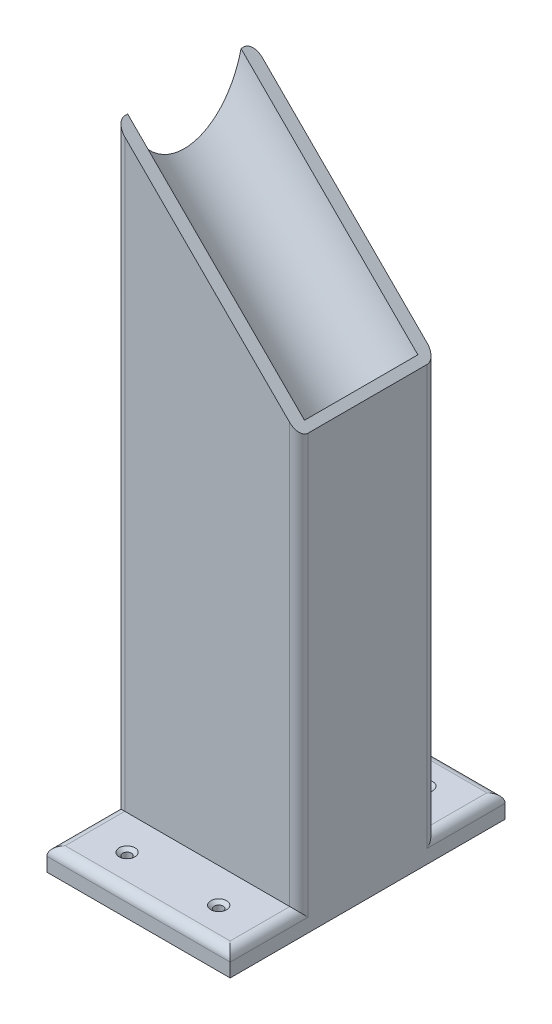
ISO-10303-21;
HEADER;
FILE_DESCRIPTION(('STEP AP214'),'2;1');
FILE_NAME('part.step','',(''),(''),'','','');
FILE_SCHEMA(('AUTOMOTIVE_DESIGN { 1 0 10303 214 1 1 1 1 }'));
ENDSEC;
DATA;
#1=APPLICATION_CONTEXT('core data for automotive mechanical design processes');
#2=APPLICATION_PROTOCOL_DEFINITION('international standard','automotive_design',2000,#1);
#3=PRODUCT_CONTEXT('',#1,'mechanical');
#4=PRODUCT('Part','Part','',(#3));
#5=PRODUCT_RELATED_PRODUCT_CATEGORY('part','',(#4));
#6=PRODUCT_DEFINITION_FORMATION('','',#4);
#7=PRODUCT_DEFINITION_CONTEXT('part definition',#1,'design');
#8=PRODUCT_DEFINITION('design','',#6,#7);
#9=PRODUCT_DEFINITION_SHAPE('','',#8);
#10=(LENGTH_UNIT() NAMED_UNIT(*) SI_UNIT(.MILLI.,.METRE.));
#11=(NAMED_UNIT(*) PLANE_ANGLE_UNIT() SI_UNIT($,.RADIAN.));
#12=(NAMED_UNIT(*) SI_UNIT($,.STERADIAN.) SOLID_ANGLE_UNIT());
#13=UNCERTAINTY_MEASURE_WITH_UNIT(LENGTH_MEASURE(1.E-05),#10,'distance_accuracy_value','');
#14=(GEOMETRIC_REPRESENTATION_CONTEXT(3) GLOBAL_UNCERTAINTY_ASSIGNED_CONTEXT((#13)) GLOBAL_UNIT_ASSIGNED_CONTEXT((#10,
#11,#12)) REPRESENTATION_CONTEXT('',''));
#15=CARTESIAN_POINT('',(0.,0.,0.));
#16=DIRECTION('',(0.,0.,1.));
#17=DIRECTION('',(1.,0.,0.));
#18=AXIS2_PLACEMENT_3D('',#15,#16,#17);
#19=CARTESIAN_POINT('',(0.,6.35,0.));
#20=DIRECTION('',(0.,1.,0.));
#21=DIRECTION('',(0.,0.,1.));
#22=AXIS2_PLACEMENT_3D('',#19,#20,#21);
#23=PLANE('',#22);
#24=CARTESIAN_POINT('',(-144.895454545455,6.35,-28.575));
#25=DIRECTION('',(0.,1.,0.));
#26=DIRECTION('',(0.,0.,1.));
#27=AXIS2_PLACEMENT_3D('',#24,#25,#26);
#28=CIRCLE('',#27,2.1844);
#29=CARTESIAN_POINT('',(-144.895454545455,6.35,-26.3906));
#30=VERTEX_POINT('',#29);
#31=EDGE_CURVE('E330',#30,#30,#28,.T.);
#32=ORIENTED_EDGE('',*,*,#31,.F.);
#33=EDGE_LOOP('',(#32));
#34=FACE_BOUND('',#33,.T.);
#35=CARTESIAN_POINT('',(-119.495454545455,6.35,-28.575));
#36=DIRECTION('',(0.,1.,0.));
#37=DIRECTION('',(0.,0.,1.));
#38=AXIS2_PLACEMENT_3D('',#35,#36,#37);
#39=CIRCLE('',#38,2.1844);
#40=CARTESIAN_POINT('',(-119.495454545455,6.35,-26.3906));
#41=VERTEX_POINT('',#40);
#42=EDGE_CURVE('E641',#41,#41,#39,.T.);
#43=ORIENTED_EDGE('',*,*,#42,.F.);
#44=EDGE_LOOP('',(#43));
#45=FACE_BOUND('',#44,.T.);
#46=DIRECTION('',(-1.,0.,0.));
#47=VECTOR('',#46,1.);
#48=CARTESIAN_POINT('',(-157.595454545455,6.35,-35.56));
#49=LINE('',#48,#47);
#50=CARTESIAN_POINT('',(-109.335454545455,6.35,-35.56));
#51=VERTEX_POINT('',#50);
#52=CARTESIAN_POINT('',(-155.055454545455,6.35,-35.56));
#53=VERTEX_POINT('',#52);
#54=EDGE_CURVE('E350',#51,#53,#49,.T.);
#55=ORIENTED_EDGE('',*,*,#54,.T.);
#56=DIRECTION('',(0.,0.,1.));
#57=VECTOR('',#56,1.);
#58=CARTESIAN_POINT('',(-155.055454545455,6.35,-16.51));
#59=LINE('',#58,#57);
#60=CARTESIAN_POINT('',(-155.055454545455,6.35,-19.05));
#61=VERTEX_POINT('',#60);
#62=EDGE_CURVE('E347',#53,#61,#59,.T.);
#63=ORIENTED_EDGE('',*,*,#62,.T.);
#64=DIRECTION('',(-1.,0.,0.));
#65=VECTOR('',#64,1.);
#66=CARTESIAN_POINT('',(-106.795454545455,6.35,-19.05));
#67=LINE('',#66,#65);
#68=CARTESIAN_POINT('',(-109.335454545455,6.35,-19.05));
#69=VERTEX_POINT('',#68);
#70=EDGE_CURVE('E203',#69,#61,#67,.T.);
#71=ORIENTED_EDGE('',*,*,#70,.F.);
#72=DIRECTION('',(0.,0.,-1.));
#73=VECTOR('',#72,1.);
#74=CARTESIAN_POINT('',(-109.335454545455,6.35,-38.1));
#75=LINE('',#74,#73);
#76=EDGE_CURVE('E352',#69,#51,#75,.T.);
#77=ORIENTED_EDGE('',*,*,#76,.T.);
#78=EDGE_LOOP('',(#55,#63,#71,#77));
#79=FACE_BOUND('',#78,.T.);
#80=ADVANCED_FACE('F34',(#34,#45,#79),#23,.T.);
#81=CARTESIAN_POINT('',(-157.595454545455,6.35,38.1));
#82=DIRECTION('',(1.,0.,0.));
#83=DIRECTION('',(0.,0.,-1.));
#84=AXIS2_PLACEMENT_3D('',#81,#82,#83);
#85=PLANE('',#84);
#86=DIRECTION('',(0.,-1.,0.));
#87=VECTOR('',#86,1.);
#88=CARTESIAN_POINT('',(-157.595454545455,6.35,-16.51));
#89=LINE('',#88,#87);
#90=CARTESIAN_POINT('',(-157.595454545455,170.772395103145,-16.51));
#91=VERTEX_POINT('',#90);
#92=CARTESIAN_POINT('',(-157.595454545455,3.81,-16.51));
#93=VERTEX_POINT('',#92);
#94=EDGE_CURVE('E208',#91,#93,#89,.T.);
#95=ORIENTED_EDGE('',*,*,#94,.T.);
#96=DIRECTION('',(0.,0.,1.));
#97=VECTOR('',#96,1.);
#98=CARTESIAN_POINT('',(-157.595454545455,3.81,-38.1));
#99=LINE('',#98,#97);
#100=CARTESIAN_POINT('',(-157.595454545455,3.81,-38.1));
#101=VERTEX_POINT('',#100);
#102=EDGE_CURVE('E264',#93,#101,#99,.F.);
#103=ORIENTED_EDGE('',*,*,#102,.T.);
#104=DIRECTION('',(0.,-1.,0.));
#105=VECTOR('',#104,1.);
#106=CARTESIAN_POINT('',(-157.595454545455,6.35,-38.1));
#107=LINE('',#106,#105);
#108=CARTESIAN_POINT('',(-157.595454545455,0.,-38.1));
#109=VERTEX_POINT('',#108);
#110=EDGE_CURVE('E242',#101,#109,#107,.T.);
#111=ORIENTED_EDGE('',*,*,#110,.T.);
#112=DIRECTION('',(0.,0.,1.));
#113=VECTOR('',#112,1.);
#114=CARTESIAN_POINT('',(-157.595454545455,0.,38.1));
#115=LINE('',#114,#113);
#116=CARTESIAN_POINT('',(-157.595454545455,0.,38.1));
#117=VERTEX_POINT('',#116);
#118=EDGE_CURVE('E227',#109,#117,#115,.T.);
#119=ORIENTED_EDGE('',*,*,#118,.T.);
#120=DIRECTION('',(0.,-1.,0.));
#121=VECTOR('',#120,1.);
#122=CARTESIAN_POINT('',(-157.595454545455,6.35,38.1));
#123=LINE('',#122,#121);
#124=CARTESIAN_POINT('',(-157.595454545455,3.81,38.1));
#125=VERTEX_POINT('',#124);
#126=EDGE_CURVE('E198',#125,#117,#123,.T.);
#127=ORIENTED_EDGE('',*,*,#126,.F.);
#128=DIRECTION('',(0.,0.,1.));
#129=VECTOR('',#128,1.);
#130=CARTESIAN_POINT('',(-157.595454545455,3.81,16.51));
#131=LINE('',#130,#129);
#132=CARTESIAN_POINT('',(-157.595454545455,3.81,16.51));
#133=VERTEX_POINT('',#132);
#134=EDGE_CURVE('E345',#125,#133,#131,.F.);
#135=ORIENTED_EDGE('',*,*,#134,.T.);
#136=DIRECTION('',(0.,-1.,0.));
#137=VECTOR('',#136,1.);
#138=CARTESIAN_POINT('',(-157.595454545455,6.35,16.51));
#139=LINE('',#138,#137);
#140=CARTESIAN_POINT('',(-157.595454545455,170.772395103145,16.51));
#141=VERTEX_POINT('',#140);
#142=EDGE_CURVE('E210',#133,#141,#139,.F.);
#143=ORIENTED_EDGE('',*,*,#142,.T.);
#144=DIRECTION('',(0.,0.,-1.));
#145=VECTOR('',#144,1.);
#146=CARTESIAN_POINT('',(-157.595454545455,170.772395103145,38.1));
#147=LINE('',#146,#145);
#148=CARTESIAN_POINT('',(-157.595454545455,170.772395103145,15.7090324336033));
#149=VERTEX_POINT('',#148);
#150=EDGE_CURVE('E170',#141,#149,#147,.T.);
#151=ORIENTED_EDGE('',*,*,#150,.T.);
#152=CARTESIAN_POINT('',(-157.595454545455,177.9566,0.));
#153=DIRECTION('',(1.,0.,0.));
#154=DIRECTION('',(0.,-1.,0.));
#155=AXIS2_PLACEMENT_3D('',#152,#153,#154);
#156=ELLIPSE('',#155,23.3486659147798,16.51);
#157=CARTESIAN_POINT('',(-157.595454545455,170.772395103145,-15.7090324336033));
#158=VERTEX_POINT('',#157);
#159=EDGE_CURVE('E189',#149,#158,#156,.T.);
#160=ORIENTED_EDGE('',*,*,#159,.T.);
#161=EDGE_CURVE('E159',#158,#91,#147,.T.);
#162=ORIENTED_EDGE('',*,*,#161,.T.);
#163=EDGE_LOOP('',(#95,#103,#111,#119,#127,#135,#143,#151,#160,#162));
#164=FACE_BOUND('',#163,.T.);
#165=ADVANCED_FACE('F261',(#164),#85,.F.);
#166=CARTESIAN_POINT('',(-106.795454545455,6.35,38.1));
#167=DIRECTION('',(0.,0.,-1.));
#168=DIRECTION('',(-1.,0.,0.));
#169=AXIS2_PLACEMENT_3D('',#166,#167,#168);
#170=PLANE('',#169);
#171=DIRECTION('',(0.,-1.,0.));
#172=VECTOR('',#171,1.);
#173=CARTESIAN_POINT('',(-106.795454545455,6.35,38.1));
#174=LINE('',#173,#172);
#175=CARTESIAN_POINT('',(-106.795454545455,3.81,38.1));
#176=VERTEX_POINT('',#175);
#177=CARTESIAN_POINT('',(-106.795454545455,0.,38.1));
#178=VERTEX_POINT('',#177);
#179=EDGE_CURVE('E245',#176,#178,#174,.T.);
#180=ORIENTED_EDGE('',*,*,#179,.F.);
#181=DIRECTION('',(1.,0.,0.));
#182=VECTOR('',#181,1.);
#183=CARTESIAN_POINT('',(-157.595454545455,3.81,38.1));
#184=LINE('',#183,#182);
#185=EDGE_CURVE('E254',#176,#125,#184,.F.);
#186=ORIENTED_EDGE('',*,*,#185,.T.);
#187=ORIENTED_EDGE('',*,*,#126,.T.);
#188=DIRECTION('',(1.,0.,0.));
#189=VECTOR('',#188,1.);
#190=CARTESIAN_POINT('',(-106.795454545455,0.,38.1));
#191=LINE('',#190,#189);
#192=EDGE_CURVE('E233',#117,#178,#191,.T.);
#193=ORIENTED_EDGE('',*,*,#192,.T.);
#194=EDGE_LOOP('',(#180,#186,#187,#193));
#195=FACE_BOUND('',#194,.T.);
#196=ADVANCED_FACE('F251',(#195),#170,.F.);
#197=CARTESIAN_POINT('',(-106.795454545455,6.35,38.1));
#198=DIRECTION('',(-1.,0.,0.));
#199=DIRECTION('',(0.,0.,1.));
#200=AXIS2_PLACEMENT_3D('',#197,#198,#199);
#201=PLANE('',#200);
#202=DIRECTION('',(0.,-1.,0.));
#203=VECTOR('',#202,1.);
#204=CARTESIAN_POINT('',(-106.795454545455,6.35,-38.1));
#205=LINE('',#204,#203);
#206=CARTESIAN_POINT('',(-106.795454545455,3.81,-38.1));
#207=VERTEX_POINT('',#206);
#208=CARTESIAN_POINT('',(-106.795454545455,0.,-38.1));
#209=VERTEX_POINT('',#208);
#210=EDGE_CURVE('E244',#207,#209,#205,.T.);
#211=ORIENTED_EDGE('',*,*,#210,.F.);
#212=DIRECTION('',(0.,0.,-1.));
#213=VECTOR('',#212,1.);
#214=CARTESIAN_POINT('',(-106.795454545455,3.81,-16.51));
#215=LINE('',#214,#213);
#216=CARTESIAN_POINT('',(-106.795454545455,3.81,-16.51));
#217=VERTEX_POINT('',#216);
#218=EDGE_CURVE('E339',#207,#217,#215,.F.);
#219=ORIENTED_EDGE('',*,*,#218,.T.);
#220=DIRECTION('',(0.,-1.,0.));
#221=VECTOR('',#220,1.);
#222=CARTESIAN_POINT('',(-106.795454545455,6.35,-16.51));
#223=LINE('',#222,#221);
#224=CARTESIAN_POINT('',(-106.795454545455,119.972395103144,-16.51));
#225=VERTEX_POINT('',#224);
#226=EDGE_CURVE('E220',#217,#225,#223,.F.);
#227=ORIENTED_EDGE('',*,*,#226,.T.);
#228=DIRECTION('',(0.,0.,1.));
#229=VECTOR('',#228,1.);
#230=CARTESIAN_POINT('',(-106.795454545455,119.972395103144,38.1));
#231=LINE('',#230,#229);
#232=CARTESIAN_POINT('',(-106.795454545455,119.972395103144,16.51));
#233=VERTEX_POINT('',#232);
#234=EDGE_CURVE('E179',#225,#233,#231,.T.);
#235=ORIENTED_EDGE('',*,*,#234,.T.);
#236=DIRECTION('',(0.,-1.,0.));
#237=VECTOR('',#236,1.);
#238=CARTESIAN_POINT('',(-106.795454545455,6.35,16.51));
#239=LINE('',#238,#237);
#240=CARTESIAN_POINT('',(-106.795454545455,3.81,16.51));
#241=VERTEX_POINT('',#240);
#242=EDGE_CURVE('E222',#233,#241,#239,.T.);
#243=ORIENTED_EDGE('',*,*,#242,.T.);
#244=DIRECTION('',(0.,0.,-1.));
#245=VECTOR('',#244,1.);
#246=CARTESIAN_POINT('',(-106.795454545455,3.81,38.1));
#247=LINE('',#246,#245);
#248=EDGE_CURVE('E338',#241,#176,#247,.F.);
#249=ORIENTED_EDGE('',*,*,#248,.T.);
#250=ORIENTED_EDGE('',*,*,#179,.T.);
#251=DIRECTION('',(0.,0.,-1.));
#252=VECTOR('',#251,1.);
#253=CARTESIAN_POINT('',(-106.795454545455,0.,38.1));
#254=LINE('',#253,#252);
#255=EDGE_CURVE('E236',#178,#209,#254,.T.);
#256=ORIENTED_EDGE('',*,*,#255,.T.);
#257=EDGE_LOOP('',(#211,#219,#227,#235,#243,#249,#250,#256));
#258=FACE_BOUND('',#257,.T.);
#259=ADVANCED_FACE('F272',(#258),#201,.F.);
#260=CARTESIAN_POINT('',(-106.795454545455,6.35,-38.1));
#261=DIRECTION('',(0.,0.,1.));
#262=DIRECTION('',(1.,0.,0.));
#263=AXIS2_PLACEMENT_3D('',#260,#261,#262);
#264=PLANE('',#263);
#265=ORIENTED_EDGE('',*,*,#110,.F.);
#266=DIRECTION('',(-1.,0.,0.));
#267=VECTOR('',#266,1.);
#268=CARTESIAN_POINT('',(-106.795454545455,3.81,-38.1));
#269=LINE('',#268,#267);
#270=EDGE_CURVE('E269',#101,#207,#269,.F.);
#271=ORIENTED_EDGE('',*,*,#270,.T.);
#272=ORIENTED_EDGE('',*,*,#210,.T.);
#273=DIRECTION('',(-1.,0.,0.));
#274=VECTOR('',#273,1.);
#275=CARTESIAN_POINT('',(-106.795454545455,0.,-38.1));
#276=LINE('',#275,#274);
#277=EDGE_CURVE('E239',#209,#109,#276,.T.);
#278=ORIENTED_EDGE('',*,*,#277,.T.);
#279=EDGE_LOOP('',(#265,#271,#272,#278));
#280=FACE_BOUND('',#279,.T.);
#281=ADVANCED_FACE('F267',(#280),#264,.F.);
#282=CARTESIAN_POINT('',(-144.895454545455,6.35,28.575));
#283=DIRECTION('',(0.,1.,0.));
#284=DIRECTION('',(0.,0.,1.));
#285=AXIS2_PLACEMENT_3D('',#282,#283,#284);
#286=CIRCLE('',#285,2.1844);
#287=CARTESIAN_POINT('',(-144.895454545455,6.35,30.7594));
#288=VERTEX_POINT('',#287);
#289=EDGE_CURVE('E303',#288,#288,#286,.T.);
#290=ORIENTED_EDGE('',*,*,#289,.F.);
#291=EDGE_LOOP('',(#290));
#292=FACE_BOUND('',#291,.T.);
#293=CARTESIAN_POINT('',(-119.495454545455,6.35,28.575));
#294=DIRECTION('',(0.,1.,0.));
#295=DIRECTION('',(0.,0.,1.));
#296=AXIS2_PLACEMENT_3D('',#293,#294,#295);
#297=CIRCLE('',#296,2.1844);
#298=CARTESIAN_POINT('',(-119.495454545455,6.35,30.7594));
#299=VERTEX_POINT('',#298);
#300=EDGE_CURVE('E306',#299,#299,#297,.T.);
#301=ORIENTED_EDGE('',*,*,#300,.F.);
#302=EDGE_LOOP('',(#301));
#303=FACE_BOUND('',#302,.T.);
#304=DIRECTION('',(1.,0.,0.));
#305=VECTOR('',#304,1.);
#306=CARTESIAN_POINT('',(-106.795454545455,6.35,19.05));
#307=LINE('',#306,#305);
#308=CARTESIAN_POINT('',(-155.055454545455,6.35,19.05));
#309=VERTEX_POINT('',#308);
#310=CARTESIAN_POINT('',(-109.335454545455,6.35,19.05));
#311=VERTEX_POINT('',#310);
#312=EDGE_CURVE('E197',#309,#311,#307,.T.);
#313=ORIENTED_EDGE('',*,*,#312,.F.);
#314=DIRECTION('',(0.,0.,1.));
#315=VECTOR('',#314,1.);
#316=CARTESIAN_POINT('',(-155.055454545455,6.35,38.1));
#317=LINE('',#316,#315);
#318=CARTESIAN_POINT('',(-155.055454545455,6.35,35.56));
#319=VERTEX_POINT('',#318);
#320=EDGE_CURVE('E308',#309,#319,#317,.T.);
#321=ORIENTED_EDGE('',*,*,#320,.T.);
#322=DIRECTION('',(1.,0.,0.));
#323=VECTOR('',#322,1.);
#324=CARTESIAN_POINT('',(-106.795454545455,6.35,35.56));
#325=LINE('',#324,#323);
#326=CARTESIAN_POINT('',(-109.335454545455,6.35,35.56));
#327=VERTEX_POINT('',#326);
#328=EDGE_CURVE('E58',#319,#327,#325,.T.);
#329=ORIENTED_EDGE('',*,*,#328,.T.);
#330=DIRECTION('',(0.,0.,-1.));
#331=VECTOR('',#330,1.);
#332=CARTESIAN_POINT('',(-109.335454545455,6.35,16.51));
#333=LINE('',#332,#331);
#334=EDGE_CURVE('E309',#327,#311,#333,.T.);
#335=ORIENTED_EDGE('',*,*,#334,.T.);
#336=EDGE_LOOP('',(#313,#321,#329,#335));
#337=FACE_BOUND('',#336,.T.);
#338=ADVANCED_FACE('F279',(#292,#303,#337),#23,.T.);
#339=CARTESIAN_POINT('',(0.,0.,0.));
#340=DIRECTION('',(0.,1.,0.));
#341=DIRECTION('',(0.,0.,1.));
#342=AXIS2_PLACEMENT_3D('',#339,#340,#341);
#343=PLANE('',#342);
#344=CARTESIAN_POINT('',(-144.895454545455,0.,-28.575));
#345=DIRECTION('',(0.,1.,0.));
#346=DIRECTION('',(0.,0.,1.));
#347=AXIS2_PLACEMENT_3D('',#344,#345,#346);
#348=CIRCLE('',#347,1.2192);
#349=CARTESIAN_POINT('',(-144.895454545455,0.,-27.3558));
#350=VERTEX_POINT('',#349);
#351=EDGE_CURVE('E644',#350,#350,#348,.T.);
#352=ORIENTED_EDGE('',*,*,#351,.T.);
#353=EDGE_LOOP('',(#352));
#354=FACE_BOUND('',#353,.T.);
#355=CARTESIAN_POINT('',(-119.495454545455,0.,-28.575));
#356=DIRECTION('',(0.,1.,0.));
#357=DIRECTION('',(0.,0.,1.));
#358=AXIS2_PLACEMENT_3D('',#355,#356,#357);
#359=CIRCLE('',#358,1.21919999999999);
#360=CARTESIAN_POINT('',(-119.495454545455,0.,-27.3558));
#361=VERTEX_POINT('',#360);
#362=EDGE_CURVE('E635',#361,#361,#359,.T.);
#363=ORIENTED_EDGE('',*,*,#362,.T.);
#364=EDGE_LOOP('',(#363));
#365=FACE_BOUND('',#364,.T.);
#366=CARTESIAN_POINT('',(-144.895454545455,0.,28.575));
#367=DIRECTION('',(0.,1.,0.));
#368=DIRECTION('',(0.,0.,1.));
#369=AXIS2_PLACEMENT_3D('',#366,#367,#368);
#370=CIRCLE('',#369,1.2192);
#371=CARTESIAN_POINT('',(-144.895454545455,0.,29.7942));
#372=VERTEX_POINT('',#371);
#373=EDGE_CURVE('E626',#372,#372,#370,.T.);
#374=ORIENTED_EDGE('',*,*,#373,.T.);
#375=EDGE_LOOP('',(#374));
#376=FACE_BOUND('',#375,.T.);
#377=CARTESIAN_POINT('',(-119.495454545455,0.,28.575));
#378=DIRECTION('',(0.,1.,0.));
#379=DIRECTION('',(0.,0.,1.));
#380=AXIS2_PLACEMENT_3D('',#377,#378,#379);
#381=CIRCLE('',#380,1.21919999999999);
#382=CARTESIAN_POINT('',(-119.495454545455,0.,29.7942));
#383=VERTEX_POINT('',#382);
#384=EDGE_CURVE('E173',#383,#383,#381,.T.);
#385=ORIENTED_EDGE('',*,*,#384,.T.);
#386=EDGE_LOOP('',(#385));
#387=FACE_BOUND('',#386,.T.);
#388=ORIENTED_EDGE('',*,*,#118,.F.);
#389=ORIENTED_EDGE('',*,*,#277,.F.);
#390=ORIENTED_EDGE('',*,*,#255,.F.);
#391=ORIENTED_EDGE('',*,*,#192,.F.);
#392=EDGE_LOOP('',(#388,#389,#390,#391));
#393=FACE_BOUND('',#392,.T.);
#394=ADVANCED_FACE('F259',(#354,#365,#376,#387,#393),#343,.F.);
#395=CARTESIAN_POINT('',(-106.795454545455,177.9566,19.05));
#396=DIRECTION('',(0.,0.,-1.));
#397=DIRECTION('',(-1.,0.,0.));
#398=AXIS2_PLACEMENT_3D('',#395,#396,#397);
#399=PLANE('',#398);
#400=DIRECTION('',(-0.707106781186546,0.707106781186549,0.));
#401=VECTOR('',#400,1.);
#402=CARTESIAN_POINT('',(-135.787556993883,148.964497551572,19.05));
#403=LINE('',#402,#401);
#404=CARTESIAN_POINT('',(-109.335454545455,122.512395103144,19.05));
#405=VERTEX_POINT('',#404);
#406=CARTESIAN_POINT('',(-155.055454545455,168.232395103145,19.05));
#407=VERTEX_POINT('',#406);
#408=EDGE_CURVE('E182',#405,#407,#403,.T.);
#409=ORIENTED_EDGE('',*,*,#408,.T.);
#410=DIRECTION('',(0.,-1.,0.));
#411=VECTOR('',#410,1.);
#412=CARTESIAN_POINT('',(-155.055454545455,177.9566,19.05));
#413=LINE('',#412,#411);
#414=EDGE_CURVE('E205',#407,#309,#413,.T.);
#415=ORIENTED_EDGE('',*,*,#414,.T.);
#416=ORIENTED_EDGE('',*,*,#312,.T.);
#417=DIRECTION('',(0.,-1.,0.));
#418=VECTOR('',#417,1.);
#419=CARTESIAN_POINT('',(-109.335454545455,177.9566,19.05));
#420=LINE('',#419,#418);
#421=EDGE_CURVE('E163',#311,#405,#420,.F.);
#422=ORIENTED_EDGE('',*,*,#421,.T.);
#423=EDGE_LOOP('',(#409,#415,#416,#422));
#424=FACE_BOUND('',#423,.T.);
#425=ADVANCED_FACE('F298',(#424),#399,.F.);
#426=CARTESIAN_POINT('',(-106.795454545455,177.9566,-19.05));
#427=DIRECTION('',(0.,0.,1.));
#428=DIRECTION('',(1.,0.,0.));
#429=AXIS2_PLACEMENT_3D('',#426,#427,#428);
#430=PLANE('',#429);
#431=DIRECTION('',(0.707106781186546,-0.707106781186549,0.));
#432=VECTOR('',#431,1.);
#433=CARTESIAN_POINT('',(-135.787556993883,148.964497551572,-19.05));
#434=LINE('',#433,#432);
#435=CARTESIAN_POINT('',(-155.055454545455,168.232395103145,-19.05));
#436=VERTEX_POINT('',#435);
#437=CARTESIAN_POINT('',(-109.335454545455,122.512395103144,-19.05));
#438=VERTEX_POINT('',#437);
#439=EDGE_CURVE('E186',#436,#438,#434,.T.);
#440=ORIENTED_EDGE('',*,*,#439,.T.);
#441=DIRECTION('',(0.,-1.,0.));
#442=VECTOR('',#441,1.);
#443=CARTESIAN_POINT('',(-109.335454545455,177.9566,-19.05));
#444=LINE('',#443,#442);
#445=EDGE_CURVE('E353',#438,#69,#444,.T.);
#446=ORIENTED_EDGE('',*,*,#445,.T.);
#447=ORIENTED_EDGE('',*,*,#70,.T.);
#448=DIRECTION('',(0.,-1.,0.));
#449=VECTOR('',#448,1.);
#450=CARTESIAN_POINT('',(-155.055454545455,177.9566,-19.05));
#451=LINE('',#450,#449);
#452=EDGE_CURVE('E224',#61,#436,#451,.F.);
#453=ORIENTED_EDGE('',*,*,#452,.T.);
#454=EDGE_LOOP('',(#440,#446,#447,#453));
#455=FACE_BOUND('',#454,.T.);
#456=ADVANCED_FACE('F360',(#455),#430,.F.);
#457=CARTESIAN_POINT('',(-157.595492045455,177.9566375,0.));
#458=DIRECTION('',(0.707106781186546,-0.707106781186549,0.));
#459=DIRECTION('',(0.707106781186549,0.707106781186546,0.));
#460=AXIS2_PLACEMENT_3D('',#457,#458,#459);
#461=CYLINDRICAL_SURFACE('',#460,16.51);
#462=DIRECTION('',(0.707106781186546,-0.707106781186549,0.));
#463=VECTOR('',#462,1.);
#464=CARTESIAN_POINT('',(-161.187594493882,174.364535051572,15.7090324336033));
#465=LINE('',#464,#463);
#466=CARTESIAN_POINT('',(-108.591505769669,121.768446327358,15.7090324336033));
#467=VERTEX_POINT('',#466);
#468=EDGE_CURVE('E164',#149,#467,#465,.T.);
#469=ORIENTED_EDGE('',*,*,#468,.T.);
#470=CARTESIAN_POINT('',(-104.999403321241,125.360548775786,0.));
#471=DIRECTION('',(-0.707106781186546,0.707106781186549,0.));
#472=DIRECTION('',(-0.707106781186549,-0.707106781186546,0.));
#473=AXIS2_PLACEMENT_3D('',#470,#471,#472);
#474=CIRCLE('',#473,16.51);
#475=CARTESIAN_POINT('',(-108.591505769669,121.768446327358,-15.7090324336033));
#476=VERTEX_POINT('',#475);
#477=EDGE_CURVE('E167',#476,#467,#474,.T.);
#478=ORIENTED_EDGE('',*,*,#477,.F.);
#479=DIRECTION('',(0.707106781186546,-0.707106781186549,0.));
#480=VECTOR('',#479,1.);
#481=CARTESIAN_POINT('',(-161.187594493882,174.364535051572,-15.7090324336033));
#482=LINE('',#481,#480);
#483=EDGE_CURVE('E151',#476,#158,#482,.F.);
#484=ORIENTED_EDGE('',*,*,#483,.T.);
#485=ORIENTED_EDGE('',*,*,#159,.F.);
#486=EDGE_LOOP('',(#469,#478,#484,#485));
#487=FACE_BOUND('',#486,.T.);
#488=ADVANCED_FACE('F168',(#487),#461,.F.);
#489=CARTESIAN_POINT('',(6.58847027884465,6.58847027884463,0.));
#490=DIRECTION('',(-0.707106781186549,-0.707106781186546,0.));
#491=DIRECTION('',(0.707106781186546,-0.707106781186549,0.));
#492=AXIS2_PLACEMENT_3D('',#489,#490,#491);
#493=PLANE('',#492);
#494=ORIENTED_EDGE('',*,*,#150,.F.);
#495=CARTESIAN_POINT('',(-155.055454545455,168.232395103145,16.51));
#496=DIRECTION('',(-0.707106781186549,-0.707106781186546,0.));
#497=DIRECTION('',(0.707106781186546,-0.707106781186549,0.));
#498=AXIS2_PLACEMENT_3D('',#495,#496,#497);
#499=ELLIPSE('',#498,3.59210244842767,2.54);
#500=EDGE_CURVE('E218',#141,#407,#499,.F.);
#501=ORIENTED_EDGE('',*,*,#500,.T.);
#502=ORIENTED_EDGE('',*,*,#408,.F.);
#503=CARTESIAN_POINT('',(-109.335454545455,122.512395103144,16.51));
#504=DIRECTION('',(-0.707106781186549,-0.707106781186546,0.));
#505=DIRECTION('',(0.707106781186546,-0.707106781186549,0.));
#506=AXIS2_PLACEMENT_3D('',#503,#504,#505);
#507=ELLIPSE('',#506,3.59210244842767,2.54);
#508=EDGE_CURVE('E216',#405,#233,#507,.F.);
#509=ORIENTED_EDGE('',*,*,#508,.T.);
#510=ORIENTED_EDGE('',*,*,#234,.F.);
#511=CARTESIAN_POINT('',(-109.335454545455,122.512395103144,-16.51));
#512=DIRECTION('',(-0.707106781186549,-0.707106781186546,0.));
#513=DIRECTION('',(0.707106781186546,-0.707106781186549,0.));
#514=AXIS2_PLACEMENT_3D('',#511,#512,#513);
#515=ELLIPSE('',#514,3.59210244842767,2.54);
#516=EDGE_CURVE('E214',#225,#438,#515,.F.);
#517=ORIENTED_EDGE('',*,*,#516,.T.);
#518=ORIENTED_EDGE('',*,*,#439,.F.);
#519=CARTESIAN_POINT('',(-155.055454545455,168.232395103145,-16.51));
#520=DIRECTION('',(-0.707106781186549,-0.707106781186546,0.));
#521=DIRECTION('',(0.707106781186546,-0.707106781186549,0.));
#522=AXIS2_PLACEMENT_3D('',#519,#520,#521);
#523=ELLIPSE('',#522,3.59210244842767,2.54);
#524=EDGE_CURVE('E212',#436,#91,#523,.F.);
#525=ORIENTED_EDGE('',*,*,#524,.T.);
#526=ORIENTED_EDGE('',*,*,#161,.F.);
#527=ORIENTED_EDGE('',*,*,#483,.F.);
#528=DIRECTION('',(0.,0.,1.));
#529=VECTOR('',#528,1.);
#530=CARTESIAN_POINT('',(-108.591505769669,121.768446327358,19.05));
#531=LINE('',#530,#529);
#532=EDGE_CURVE('E157',#476,#467,#531,.T.);
#533=ORIENTED_EDGE('',*,*,#532,.T.);
#534=ORIENTED_EDGE('',*,*,#468,.F.);
#535=EDGE_LOOP('',(#494,#501,#502,#509,#510,#517,#518,#525,#526,#527,#533,#534));
#536=FACE_BOUND('',#535,.T.);
#537=ADVANCED_FACE('F154',(#536),#493,.F.);
#538=CARTESIAN_POINT('',(-223.907866561512,6.45208553551538,19.05));
#539=DIRECTION('',(-0.707106781186546,0.707106781186549,0.));
#540=DIRECTION('',(-0.707106781186549,-0.707106781186546,0.));
#541=AXIS2_PLACEMENT_3D('',#538,#539,#540);
#542=PLANE('',#541);
#543=ORIENTED_EDGE('',*,*,#532,.F.);
#544=ORIENTED_EDGE('',*,*,#477,.T.);
#545=EDGE_LOOP('',(#543,#544));
#546=FACE_BOUND('',#545,.T.);
#547=ADVANCED_FACE('F172',(#546),#542,.T.);
#548=CARTESIAN_POINT('',(-119.495454545455,6.35,28.575));
#549=DIRECTION('',(0.,1.,0.));
#550=DIRECTION('',(0.,0.,1.));
#551=AXIS2_PLACEMENT_3D('',#548,#549,#550);
#552=CYLINDRICAL_SURFACE('',#551,1.21919999999999);
#553=ORIENTED_EDGE('',*,*,#384,.F.);
#554=EDGE_LOOP('',(#553));
#555=FACE_BOUND('',#554,.T.);
#556=CARTESIAN_POINT('',(-119.495454545455,5.54010103598768,28.575));
#557=DIRECTION('',(0.,1.,0.));
#558=DIRECTION('',(0.,0.,1.));
#559=AXIS2_PLACEMENT_3D('',#556,#557,#558);
#560=CIRCLE('',#559,1.21919999999999);
#561=CARTESIAN_POINT('',(-119.495454545455,5.54010103598768,29.7942));
#562=VERTEX_POINT('',#561);
#563=EDGE_CURVE('E176',#562,#562,#560,.T.);
#564=ORIENTED_EDGE('',*,*,#563,.T.);
#565=EDGE_LOOP('',(#564));
#566=FACE_BOUND('',#565,.T.);
#567=ADVANCED_FACE('F591',(#555,#566),#552,.F.);
#568=CARTESIAN_POINT('',(-119.495454545455,6.35,28.575));
#569=DIRECTION('',(0.,1.,0.));
#570=DIRECTION('',(0.,0.,1.));
#571=AXIS2_PLACEMENT_3D('',#568,#569,#570);
#572=CONICAL_SURFACE('',#571,2.1844,0.872664625997167);
#573=ORIENTED_EDGE('',*,*,#563,.F.);
#574=EDGE_LOOP('',(#573));
#575=FACE_BOUND('',#574,.T.);
#576=ORIENTED_EDGE('',*,*,#300,.T.);
#577=EDGE_LOOP('',(#576));
#578=FACE_BOUND('',#577,.T.);
#579=ADVANCED_FACE('F581',(#575,#578),#572,.F.);
#580=CARTESIAN_POINT('',(-144.895454545455,6.35,28.575));
#581=DIRECTION('',(0.,1.,0.));
#582=DIRECTION('',(0.,0.,1.));
#583=AXIS2_PLACEMENT_3D('',#580,#581,#582);
#584=CYLINDRICAL_SURFACE('',#583,1.2192);
#585=ORIENTED_EDGE('',*,*,#373,.F.);
#586=EDGE_LOOP('',(#585));
#587=FACE_BOUND('',#586,.T.);
#588=CARTESIAN_POINT('',(-144.895454545455,5.54010103598768,28.575));
#589=DIRECTION('',(0.,1.,0.));
#590=DIRECTION('',(0.,0.,1.));
#591=AXIS2_PLACEMENT_3D('',#588,#589,#590);
#592=CIRCLE('',#591,1.2192);
#593=CARTESIAN_POINT('',(-144.895454545455,5.54010103598768,29.7942));
#594=VERTEX_POINT('',#593);
#595=EDGE_CURVE('E631',#594,#594,#592,.T.);
#596=ORIENTED_EDGE('',*,*,#595,.T.);
#597=EDGE_LOOP('',(#596));
#598=FACE_BOUND('',#597,.T.);
#599=ADVANCED_FACE('F571',(#587,#598),#584,.F.);
#600=CARTESIAN_POINT('',(-144.895454545455,6.35,28.575));
#601=DIRECTION('',(0.,1.,0.));
#602=DIRECTION('',(0.,0.,1.));
#603=AXIS2_PLACEMENT_3D('',#600,#601,#602);
#604=CONICAL_SURFACE('',#603,2.1844,0.87266462599716);
#605=ORIENTED_EDGE('',*,*,#595,.F.);
#606=EDGE_LOOP('',(#605));
#607=FACE_BOUND('',#606,.T.);
#608=ORIENTED_EDGE('',*,*,#289,.T.);
#609=EDGE_LOOP('',(#608));
#610=FACE_BOUND('',#609,.T.);
#611=ADVANCED_FACE('F556',(#607,#610),#604,.F.);
#612=CARTESIAN_POINT('',(-119.495454545455,6.35,-28.575));
#613=DIRECTION('',(0.,1.,0.));
#614=DIRECTION('',(0.,0.,1.));
#615=AXIS2_PLACEMENT_3D('',#612,#613,#614);
#616=CYLINDRICAL_SURFACE('',#615,1.21919999999999);
#617=ORIENTED_EDGE('',*,*,#362,.F.);
#618=EDGE_LOOP('',(#617));
#619=FACE_BOUND('',#618,.T.);
#620=CARTESIAN_POINT('',(-119.495454545455,5.54010103598768,-28.575));
#621=DIRECTION('',(0.,1.,0.));
#622=DIRECTION('',(0.,0.,1.));
#623=AXIS2_PLACEMENT_3D('',#620,#621,#622);
#624=CIRCLE('',#623,1.21919999999999);
#625=CARTESIAN_POINT('',(-119.495454545455,5.54010103598768,-27.3558));
#626=VERTEX_POINT('',#625);
#627=EDGE_CURVE('E638',#626,#626,#624,.T.);
#628=ORIENTED_EDGE('',*,*,#627,.T.);
#629=EDGE_LOOP('',(#628));
#630=FACE_BOUND('',#629,.T.);
#631=ADVANCED_FACE('F546',(#619,#630),#616,.F.);
#632=CARTESIAN_POINT('',(-119.495454545455,6.35,-28.575));
#633=DIRECTION('',(0.,1.,0.));
#634=DIRECTION('',(0.,0.,1.));
#635=AXIS2_PLACEMENT_3D('',#632,#633,#634);
#636=CONICAL_SURFACE('',#635,2.1844,0.872664625997167);
#637=ORIENTED_EDGE('',*,*,#627,.F.);
#638=EDGE_LOOP('',(#637));
#639=FACE_BOUND('',#638,.T.);
#640=ORIENTED_EDGE('',*,*,#42,.T.);
#641=EDGE_LOOP('',(#640));
#642=FACE_BOUND('',#641,.T.);
#643=ADVANCED_FACE('F536',(#639,#642),#636,.F.);
#644=CARTESIAN_POINT('',(-144.895454545455,6.35,-28.575));
#645=DIRECTION('',(0.,1.,0.));
#646=DIRECTION('',(0.,0.,1.));
#647=AXIS2_PLACEMENT_3D('',#644,#645,#646);
#648=CYLINDRICAL_SURFACE('',#647,1.2192);
#649=ORIENTED_EDGE('',*,*,#351,.F.);
#650=EDGE_LOOP('',(#649));
#651=FACE_BOUND('',#650,.T.);
#652=CARTESIAN_POINT('',(-144.895454545455,5.54010103598768,-28.575));
#653=DIRECTION('',(0.,1.,0.));
#654=DIRECTION('',(0.,0.,1.));
#655=AXIS2_PLACEMENT_3D('',#652,#653,#654);
#656=CIRCLE('',#655,1.2192);
#657=CARTESIAN_POINT('',(-144.895454545455,5.54010103598768,-27.3558));
#658=VERTEX_POINT('',#657);
#659=EDGE_CURVE('E647',#658,#658,#656,.T.);
#660=ORIENTED_EDGE('',*,*,#659,.T.);
#661=EDGE_LOOP('',(#660));
#662=FACE_BOUND('',#661,.T.);
#663=ADVANCED_FACE('F526',(#651,#662),#648,.F.);
#664=CARTESIAN_POINT('',(-144.895454545455,6.35,-28.575));
#665=DIRECTION('',(0.,1.,0.));
#666=DIRECTION('',(0.,0.,1.));
#667=AXIS2_PLACEMENT_3D('',#664,#665,#666);
#668=CONICAL_SURFACE('',#667,2.1844,0.87266462599716);
#669=ORIENTED_EDGE('',*,*,#659,.F.);
#670=EDGE_LOOP('',(#669));
#671=FACE_BOUND('',#670,.T.);
#672=ORIENTED_EDGE('',*,*,#31,.T.);
#673=EDGE_LOOP('',(#672));
#674=FACE_BOUND('',#673,.T.);
#675=ADVANCED_FACE('F454',(#671,#674),#668,.F.);
#676=CARTESIAN_POINT('',(-155.055454545455,177.9566,16.51));
#677=DIRECTION('',(0.,-1.,0.));
#678=DIRECTION('',(0.,0.,-1.));
#679=AXIS2_PLACEMENT_3D('',#676,#677,#678);
#680=CYLINDRICAL_SURFACE('',#679,2.54);
#681=ORIENTED_EDGE('',*,*,#500,.F.);
#682=ORIENTED_EDGE('',*,*,#142,.F.);
#683=CARTESIAN_POINT('',(-155.055454545455,3.81,16.51));
#684=DIRECTION('',(0.,0.707106781186547,-0.707106781186547));
#685=DIRECTION('',(0.,-0.707106781186547,-0.707106781186547));
#686=AXIS2_PLACEMENT_3D('',#683,#684,#685);
#687=ELLIPSE('',#686,3.59210244842766,2.54);
#688=EDGE_CURVE('E43',#133,#309,#687,.T.);
#689=ORIENTED_EDGE('',*,*,#688,.T.);
#690=ORIENTED_EDGE('',*,*,#414,.F.);
#691=EDGE_LOOP('',(#681,#682,#689,#690));
#692=FACE_BOUND('',#691,.T.);
#693=ADVANCED_FACE('F371',(#692),#680,.T.);
#694=CARTESIAN_POINT('',(-109.335454545455,6.35,16.51));
#695=DIRECTION('',(0.,-1.,0.));
#696=DIRECTION('',(0.,0.,-1.));
#697=AXIS2_PLACEMENT_3D('',#694,#695,#696);
#698=CYLINDRICAL_SURFACE('',#697,2.54);
#699=ORIENTED_EDGE('',*,*,#508,.F.);
#700=ORIENTED_EDGE('',*,*,#421,.F.);
#701=CARTESIAN_POINT('',(-109.335454545455,3.81,16.51));
#702=DIRECTION('',(0.,-0.707106781186547,0.707106781186547));
#703=DIRECTION('',(0.,0.707106781186547,0.707106781186547));
#704=AXIS2_PLACEMENT_3D('',#701,#702,#703);
#705=ELLIPSE('',#704,3.59210244842766,2.54);
#706=EDGE_CURVE('E12',#311,#241,#705,.F.);
#707=ORIENTED_EDGE('',*,*,#706,.T.);
#708=ORIENTED_EDGE('',*,*,#242,.F.);
#709=EDGE_LOOP('',(#699,#700,#707,#708));
#710=FACE_BOUND('',#709,.T.);
#711=ADVANCED_FACE('F375',(#710),#698,.T.);
#712=CARTESIAN_POINT('',(-109.335454545455,177.9566,-16.51));
#713=DIRECTION('',(0.,-1.,0.));
#714=DIRECTION('',(0.,0.,-1.));
#715=AXIS2_PLACEMENT_3D('',#712,#713,#714);
#716=CYLINDRICAL_SURFACE('',#715,2.54);
#717=ORIENTED_EDGE('',*,*,#516,.F.);
#718=ORIENTED_EDGE('',*,*,#226,.F.);
#719=CARTESIAN_POINT('',(-109.335454545455,3.81,-16.51));
#720=DIRECTION('',(0.,0.707106781186547,0.707106781186547));
#721=DIRECTION('',(0.,-0.707106781186547,0.707106781186547));
#722=AXIS2_PLACEMENT_3D('',#719,#720,#721);
#723=ELLIPSE('',#722,3.59210244842766,2.54);
#724=EDGE_CURVE('E322',#217,#69,#723,.T.);
#725=ORIENTED_EDGE('',*,*,#724,.T.);
#726=ORIENTED_EDGE('',*,*,#445,.F.);
#727=EDGE_LOOP('',(#717,#718,#725,#726));
#728=FACE_BOUND('',#727,.T.);
#729=ADVANCED_FACE('F377',(#728),#716,.T.);
#730=CARTESIAN_POINT('',(-155.055454545455,6.35,-16.51));
#731=DIRECTION('',(0.,-1.,0.));
#732=DIRECTION('',(0.,0.,-1.));
#733=AXIS2_PLACEMENT_3D('',#730,#731,#732);
#734=CYLINDRICAL_SURFACE('',#733,2.54);
#735=ORIENTED_EDGE('',*,*,#524,.F.);
#736=ORIENTED_EDGE('',*,*,#452,.F.);
#737=CARTESIAN_POINT('',(-155.055454545455,3.81,-16.51));
#738=DIRECTION('',(0.,-0.707106781186547,-0.707106781186547));
#739=DIRECTION('',(0.,0.707106781186547,-0.707106781186547));
#740=AXIS2_PLACEMENT_3D('',#737,#738,#739);
#741=ELLIPSE('',#740,3.59210244842766,2.54);
#742=EDGE_CURVE('E315',#61,#93,#741,.F.);
#743=ORIENTED_EDGE('',*,*,#742,.T.);
#744=ORIENTED_EDGE('',*,*,#94,.F.);
#745=EDGE_LOOP('',(#735,#736,#743,#744));
#746=FACE_BOUND('',#745,.T.);
#747=ADVANCED_FACE('F366',(#746),#734,.T.);
#748=CARTESIAN_POINT('',(-109.335454545455,3.81,0.));
#749=DIRECTION('',(0.,0.,1.));
#750=DIRECTION('',(1.,0.,0.));
#751=AXIS2_PLACEMENT_3D('',#748,#749,#750);
#752=CYLINDRICAL_SURFACE('',#751,2.54);
#753=ORIENTED_EDGE('',*,*,#724,.F.);
#754=ORIENTED_EDGE('',*,*,#218,.F.);
#755=CARTESIAN_POINT('',(-109.335454545455,3.81,-35.56));
#756=DIRECTION('',(0.707106781186548,0.,0.707106781186547));
#757=DIRECTION('',(-0.707106781186547,0.,0.707106781186548));
#758=AXIS2_PLACEMENT_3D('',#755,#756,#757);
#759=ELLIPSE('',#758,3.59210244842766,2.54);
#760=EDGE_CURVE('E328',#51,#207,#759,.F.);
#761=ORIENTED_EDGE('',*,*,#760,.F.);
#762=ORIENTED_EDGE('',*,*,#76,.F.);
#763=EDGE_LOOP('',(#753,#754,#761,#762));
#764=FACE_BOUND('',#763,.T.);
#765=ADVANCED_FACE('F381',(#764),#752,.T.);
#766=CARTESIAN_POINT('',(0.,3.81,-35.56));
#767=DIRECTION('',(1.,0.,0.));
#768=DIRECTION('',(0.,0.,-1.));
#769=AXIS2_PLACEMENT_3D('',#766,#767,#768);
#770=CYLINDRICAL_SURFACE('',#769,2.54);
#771=ORIENTED_EDGE('',*,*,#760,.T.);
#772=ORIENTED_EDGE('',*,*,#270,.F.);
#773=CARTESIAN_POINT('',(-155.055454545455,3.81,-35.56));
#774=DIRECTION('',(0.707106781186547,0.,-0.707106781186548));
#775=DIRECTION('',(0.707106781186548,0.,0.707106781186547));
#776=AXIS2_PLACEMENT_3D('',#773,#774,#775);
#777=ELLIPSE('',#776,3.59210244842766,2.54);
#778=EDGE_CURVE('E325',#53,#101,#777,.F.);
#779=ORIENTED_EDGE('',*,*,#778,.F.);
#780=ORIENTED_EDGE('',*,*,#54,.F.);
#781=EDGE_LOOP('',(#771,#772,#779,#780));
#782=FACE_BOUND('',#781,.T.);
#783=ADVANCED_FACE('F390',(#782),#770,.T.);
#784=CARTESIAN_POINT('',(-155.055454545455,3.81,0.));
#785=DIRECTION('',(0.,0.,-1.));
#786=DIRECTION('',(-1.,0.,0.));
#787=AXIS2_PLACEMENT_3D('',#784,#785,#786);
#788=CYLINDRICAL_SURFACE('',#787,2.54);
#789=ORIENTED_EDGE('',*,*,#778,.T.);
#790=ORIENTED_EDGE('',*,*,#102,.F.);
#791=ORIENTED_EDGE('',*,*,#742,.F.);
#792=ORIENTED_EDGE('',*,*,#62,.F.);
#793=EDGE_LOOP('',(#789,#790,#791,#792));
#794=FACE_BOUND('',#793,.T.);
#795=ADVANCED_FACE('F388',(#794),#788,.T.);
#796=CARTESIAN_POINT('',(-109.335454545455,3.81,0.));
#797=DIRECTION('',(0.,0.,1.));
#798=DIRECTION('',(1.,0.,0.));
#799=AXIS2_PLACEMENT_3D('',#796,#797,#798);
#800=CYLINDRICAL_SURFACE('',#799,2.54);
#801=ORIENTED_EDGE('',*,*,#706,.F.);
#802=ORIENTED_EDGE('',*,*,#334,.F.);
#803=CARTESIAN_POINT('',(-109.335454545455,3.81,35.56));
#804=DIRECTION('',(-0.707106781186547,0.,0.707106781186548));
#805=DIRECTION('',(0.707106781186548,0.,0.707106781186547));
#806=AXIS2_PLACEMENT_3D('',#803,#804,#805);
#807=ELLIPSE('',#806,3.59210244842766,2.54);
#808=EDGE_CURVE('E38',#176,#327,#807,.T.);
#809=ORIENTED_EDGE('',*,*,#808,.F.);
#810=ORIENTED_EDGE('',*,*,#248,.F.);
#811=EDGE_LOOP('',(#801,#802,#809,#810));
#812=FACE_BOUND('',#811,.T.);
#813=ADVANCED_FACE('F36',(#812),#800,.T.);
#814=CARTESIAN_POINT('',(0.,3.81,35.56));
#815=DIRECTION('',(-1.,0.,0.));
#816=DIRECTION('',(0.,0.,1.));
#817=AXIS2_PLACEMENT_3D('',#814,#815,#816);
#818=CYLINDRICAL_SURFACE('',#817,2.54);
#819=ORIENTED_EDGE('',*,*,#808,.T.);
#820=ORIENTED_EDGE('',*,*,#328,.F.);
#821=CARTESIAN_POINT('',(-155.055454545455,3.81,35.56));
#822=DIRECTION('',(-0.707106781186548,0.,-0.707106781186547));
#823=DIRECTION('',(-0.707106781186547,0.,0.707106781186548));
#824=AXIS2_PLACEMENT_3D('',#821,#822,#823);
#825=ELLIPSE('',#824,3.59210244842766,2.54);
#826=EDGE_CURVE('E51',#125,#319,#825,.T.);
#827=ORIENTED_EDGE('',*,*,#826,.F.);
#828=ORIENTED_EDGE('',*,*,#185,.F.);
#829=EDGE_LOOP('',(#819,#820,#827,#828));
#830=FACE_BOUND('',#829,.T.);
#831=ADVANCED_FACE('F334',(#830),#818,.T.);
#832=CARTESIAN_POINT('',(-155.055454545455,3.81,0.));
#833=DIRECTION('',(0.,0.,-1.));
#834=DIRECTION('',(-1.,0.,0.));
#835=AXIS2_PLACEMENT_3D('',#832,#833,#834);
#836=CYLINDRICAL_SURFACE('',#835,2.54);
#837=ORIENTED_EDGE('',*,*,#688,.F.);
#838=ORIENTED_EDGE('',*,*,#134,.F.);
#839=ORIENTED_EDGE('',*,*,#826,.T.);
#840=ORIENTED_EDGE('',*,*,#320,.F.);
#841=EDGE_LOOP('',(#837,#838,#839,#840));
#842=FACE_BOUND('',#841,.T.);
#843=ADVANCED_FACE('F313',(#842),#836,.T.);
#844=CLOSED_SHELL('',(#80,#165,#196,#259,#281,#338,#394,#425,#456,#488,#537,#547,#567,#579,#599,
#611,#631,#643,#663,#675,#693,#711,#729,#747,#765,#783,#795,#813,#831,#843));
#845=MANIFOLD_SOLID_BREP('B2',#844);
#846=ADVANCED_BREP_SHAPE_REPRESENTATION('',(#18,#845),#14);
#847=SHAPE_DEFINITION_REPRESENTATION(#9,#846);
ENDSEC;
END-ISO-10303-21;
